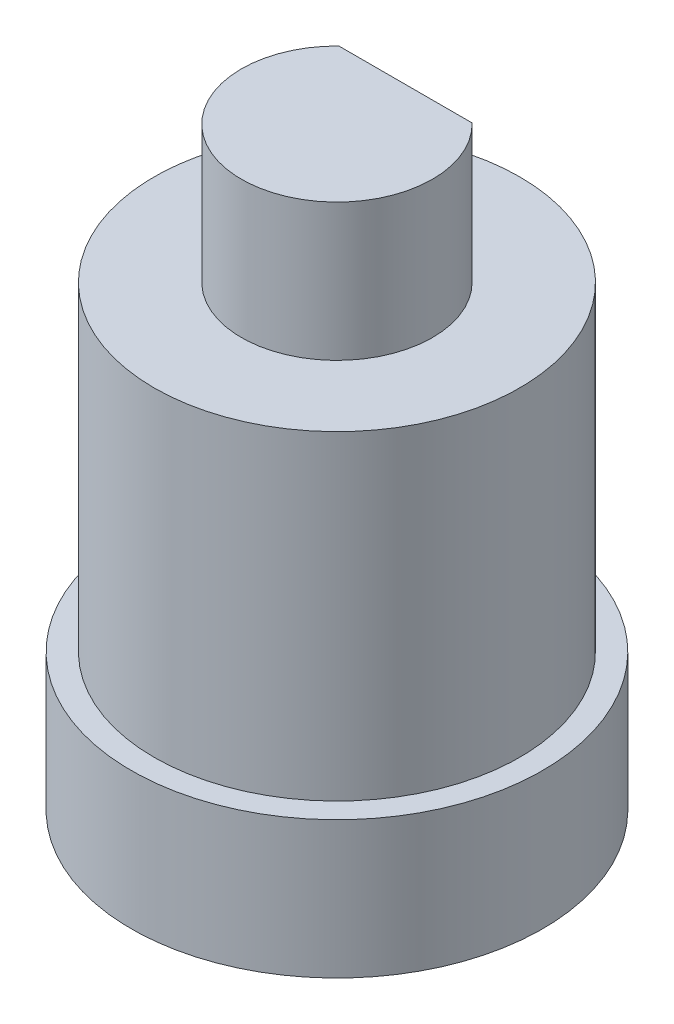
ISO-10303-21;
HEADER;
FILE_DESCRIPTION(('STEP AP214'),'2;1');
FILE_NAME('part.step','',(''),(''),'','','');
FILE_SCHEMA(('AUTOMOTIVE_DESIGN { 1 0 10303 214 1 1 1 1 }'));
ENDSEC;
DATA;
#1=APPLICATION_CONTEXT('core data for automotive mechanical design processes');
#2=APPLICATION_PROTOCOL_DEFINITION('international standard','automotive_design',2000,#1);
#3=PRODUCT_CONTEXT('',#1,'mechanical');
#4=PRODUCT('Part','Part','',(#3));
#5=PRODUCT_RELATED_PRODUCT_CATEGORY('part','',(#4));
#6=PRODUCT_DEFINITION_FORMATION('','',#4);
#7=PRODUCT_DEFINITION_CONTEXT('part definition',#1,'design');
#8=PRODUCT_DEFINITION('design','',#6,#7);
#9=PRODUCT_DEFINITION_SHAPE('','',#8);
#10=(LENGTH_UNIT() NAMED_UNIT(*) SI_UNIT(.MILLI.,.METRE.));
#11=(NAMED_UNIT(*) PLANE_ANGLE_UNIT() SI_UNIT($,.RADIAN.));
#12=(NAMED_UNIT(*) SI_UNIT($,.STERADIAN.) SOLID_ANGLE_UNIT());
#13=UNCERTAINTY_MEASURE_WITH_UNIT(LENGTH_MEASURE(1.E-05),#10,'distance_accuracy_value','');
#14=(GEOMETRIC_REPRESENTATION_CONTEXT(3) GLOBAL_UNCERTAINTY_ASSIGNED_CONTEXT((#13)) GLOBAL_UNIT_ASSIGNED_CONTEXT((#10,
#11,#12)) REPRESENTATION_CONTEXT('',''));
#15=CARTESIAN_POINT('',(0.,0.,0.));
#16=DIRECTION('',(0.,0.,1.));
#17=DIRECTION('',(1.,0.,0.));
#18=AXIS2_PLACEMENT_3D('',#15,#16,#17);
#19=CARTESIAN_POINT('',(0.,10.,0.));
#20=DIRECTION('',(0.,-1.,0.));
#21=DIRECTION('',(0.,0.,-1.));
#22=AXIS2_PLACEMENT_3D('',#19,#20,#21);
#23=CYLINDRICAL_SURFACE('',#22,4.);
#24=CARTESIAN_POINT('',(0.,10.,0.));
#25=DIRECTION('',(0.,1.,0.));
#26=DIRECTION('',(0.,0.,1.));
#27=AXIS2_PLACEMENT_3D('',#24,#25,#26);
#28=CIRCLE('',#27,4.);
#29=CARTESIAN_POINT('',(0.,10.,4.));
#30=VERTEX_POINT('',#29);
#31=EDGE_CURVE('E49',#30,#30,#28,.T.);
#32=ORIENTED_EDGE('',*,*,#31,.F.);
#33=EDGE_LOOP('',(#32));
#34=FACE_BOUND('',#33,.T.);
#35=CARTESIAN_POINT('',(0.,3.,0.));
#36=DIRECTION('',(0.,-1.,0.));
#37=DIRECTION('',(0.,0.,-1.));
#38=AXIS2_PLACEMENT_3D('',#35,#36,#37);
#39=CIRCLE('',#38,4.);
#40=CARTESIAN_POINT('',(0.,3.,-4.));
#41=VERTEX_POINT('',#40);
#42=EDGE_CURVE('E11',#41,#41,#39,.T.);
#43=ORIENTED_EDGE('',*,*,#42,.F.);
#44=EDGE_LOOP('',(#43));
#45=FACE_BOUND('',#44,.T.);
#46=ADVANCED_FACE('F41',(#34,#45),#23,.T.);
#47=CARTESIAN_POINT('',(0.,10.,0.));
#48=DIRECTION('',(0.,1.,0.));
#49=DIRECTION('',(0.,0.,1.));
#50=AXIS2_PLACEMENT_3D('',#47,#48,#49);
#51=PLANE('',#50);
#52=ORIENTED_EDGE('',*,*,#31,.T.);
#53=EDGE_LOOP('',(#52));
#54=FACE_BOUND('',#53,.T.);
#55=CARTESIAN_POINT('',(0.,10.,0.));
#56=DIRECTION('',(0.,1.,0.));
#57=DIRECTION('',(0.,0.,1.));
#58=AXIS2_PLACEMENT_3D('',#55,#56,#57);
#59=CIRCLE('',#58,2.09157135297884);
#60=CARTESIAN_POINT('',(-1.45762502880602,10.,-1.5));
#61=VERTEX_POINT('',#60);
#62=CARTESIAN_POINT('',(1.45762502880602,10.,-1.5));
#63=VERTEX_POINT('',#62);
#64=EDGE_CURVE('E55',#61,#63,#59,.T.);
#65=ORIENTED_EDGE('',*,*,#64,.F.);
#66=DIRECTION('',(1.,0.,0.));
#67=VECTOR('',#66,1.);
#68=CARTESIAN_POINT('',(0.,10.,-1.5));
#69=LINE('',#68,#67);
#70=EDGE_CURVE('E69',#61,#63,#69,.T.);
#71=ORIENTED_EDGE('',*,*,#70,.T.);
#72=EDGE_LOOP('',(#65,#71));
#73=FACE_BOUND('',#72,.T.);
#74=ADVANCED_FACE('F71',(#54,#73),#51,.T.);
#75=CARTESIAN_POINT('',(0.,13.,-1.5));
#76=DIRECTION('',(0.,0.,-1.));
#77=DIRECTION('',(-1.,0.,0.));
#78=AXIS2_PLACEMENT_3D('',#75,#76,#77);
#79=PLANE('',#78);
#80=ORIENTED_EDGE('',*,*,#70,.F.);
#81=DIRECTION('',(0.,-1.,0.));
#82=VECTOR('',#81,1.);
#83=CARTESIAN_POINT('',(-1.45762502880602,13.,-1.5));
#84=LINE('',#83,#82);
#85=CARTESIAN_POINT('',(-1.45762502880602,13.,-1.5));
#86=VERTEX_POINT('',#85);
#87=EDGE_CURVE('E82',#86,#61,#84,.T.);
#88=ORIENTED_EDGE('',*,*,#87,.F.);
#89=DIRECTION('',(1.,0.,0.));
#90=VECTOR('',#89,1.);
#91=CARTESIAN_POINT('',(0.,13.,-1.5));
#92=LINE('',#91,#90);
#93=CARTESIAN_POINT('',(1.45762502880602,13.,-1.5));
#94=VERTEX_POINT('',#93);
#95=EDGE_CURVE('E79',#86,#94,#92,.T.);
#96=ORIENTED_EDGE('',*,*,#95,.T.);
#97=DIRECTION('',(0.,-1.,0.));
#98=VECTOR('',#97,1.);
#99=CARTESIAN_POINT('',(1.45762502880602,13.,-1.5));
#100=LINE('',#99,#98);
#101=EDGE_CURVE('E77',#94,#63,#100,.T.);
#102=ORIENTED_EDGE('',*,*,#101,.T.);
#103=EDGE_LOOP('',(#80,#88,#96,#102));
#104=FACE_BOUND('',#103,.T.);
#105=ADVANCED_FACE('F78',(#104),#79,.T.);
#106=CARTESIAN_POINT('',(0.,13.,0.));
#107=DIRECTION('',(0.,-1.,0.));
#108=DIRECTION('',(0.,0.,-1.));
#109=AXIS2_PLACEMENT_3D('',#106,#107,#108);
#110=CYLINDRICAL_SURFACE('',#109,2.09157135297884);
#111=ORIENTED_EDGE('',*,*,#64,.T.);
#112=ORIENTED_EDGE('',*,*,#101,.F.);
#113=CARTESIAN_POINT('',(0.,13.,0.));
#114=DIRECTION('',(0.,1.,0.));
#115=DIRECTION('',(0.,0.,1.));
#116=AXIS2_PLACEMENT_3D('',#113,#114,#115);
#117=CIRCLE('',#116,2.09157135297884);
#118=EDGE_CURVE('E63',#86,#94,#117,.T.);
#119=ORIENTED_EDGE('',*,*,#118,.F.);
#120=ORIENTED_EDGE('',*,*,#87,.T.);
#121=EDGE_LOOP('',(#111,#112,#119,#120));
#122=FACE_BOUND('',#121,.T.);
#123=ADVANCED_FACE('F84',(#122),#110,.T.);
#124=CARTESIAN_POINT('',(0.,13.,0.));
#125=DIRECTION('',(0.,1.,0.));
#126=DIRECTION('',(0.,0.,1.));
#127=AXIS2_PLACEMENT_3D('',#124,#125,#126);
#128=PLANE('',#127);
#129=ORIENTED_EDGE('',*,*,#95,.F.);
#130=ORIENTED_EDGE('',*,*,#118,.T.);
#131=EDGE_LOOP('',(#129,#130));
#132=FACE_BOUND('',#131,.T.);
#133=ADVANCED_FACE('F121',(#132),#128,.T.);
#134=CARTESIAN_POINT('',(0.,3.,0.));
#135=DIRECTION('',(0.,-1.,0.));
#136=DIRECTION('',(0.,0.,-1.));
#137=AXIS2_PLACEMENT_3D('',#134,#135,#136);
#138=CYLINDRICAL_SURFACE('',#137,4.5);
#139=CARTESIAN_POINT('',(0.,3.,0.));
#140=DIRECTION('',(0.,-1.,0.));
#141=DIRECTION('',(0.,0.,-1.));
#142=AXIS2_PLACEMENT_3D('',#139,#140,#141);
#143=CIRCLE('',#142,4.5);
#144=CARTESIAN_POINT('',(0.,3.,-4.5));
#145=VERTEX_POINT('',#144);
#146=EDGE_CURVE('E74',#145,#145,#143,.T.);
#147=ORIENTED_EDGE('',*,*,#146,.T.);
#148=EDGE_LOOP('',(#147));
#149=FACE_BOUND('',#148,.T.);
#150=CARTESIAN_POINT('',(0.,0.,0.));
#151=DIRECTION('',(0.,-1.,0.));
#152=DIRECTION('',(0.,0.,-1.));
#153=AXIS2_PLACEMENT_3D('',#150,#151,#152);
#154=CIRCLE('',#153,4.5);
#155=CARTESIAN_POINT('',(0.,0.,-4.5));
#156=VERTEX_POINT('',#155);
#157=EDGE_CURVE('E111',#156,#156,#154,.T.);
#158=ORIENTED_EDGE('',*,*,#157,.F.);
#159=EDGE_LOOP('',(#158));
#160=FACE_BOUND('',#159,.T.);
#161=ADVANCED_FACE('F105',(#149,#160),#138,.T.);
#162=CARTESIAN_POINT('',(0.,3.,0.));
#163=DIRECTION('',(0.,-1.,0.));
#164=DIRECTION('',(0.,0.,-1.));
#165=AXIS2_PLACEMENT_3D('',#162,#163,#164);
#166=PLANE('',#165);
#167=ORIENTED_EDGE('',*,*,#42,.T.);
#168=EDGE_LOOP('',(#167));
#169=FACE_BOUND('',#168,.T.);
#170=ORIENTED_EDGE('',*,*,#146,.F.);
#171=EDGE_LOOP('',(#170));
#172=FACE_BOUND('',#171,.T.);
#173=ADVANCED_FACE('F101',(#169,#172),#166,.F.);
#174=CARTESIAN_POINT('',(0.,0.,0.));
#175=DIRECTION('',(0.,1.,0.));
#176=DIRECTION('',(0.,0.,1.));
#177=AXIS2_PLACEMENT_3D('',#174,#175,#176);
#178=PLANE('',#177);
#179=ORIENTED_EDGE('',*,*,#157,.T.);
#180=EDGE_LOOP('',(#179));
#181=FACE_BOUND('',#180,.T.);
#182=ADVANCED_FACE('F104',(#181),#178,.F.);
#183=CLOSED_SHELL('',(#46,#74,#105,#123,#133,#161,#173,#182));
#184=MANIFOLD_SOLID_BREP('B2',#183);
#185=ADVANCED_BREP_SHAPE_REPRESENTATION('',(#18,#184),#14);
#186=SHAPE_DEFINITION_REPRESENTATION(#9,#185);
ENDSEC;
END-ISO-10303-21;
